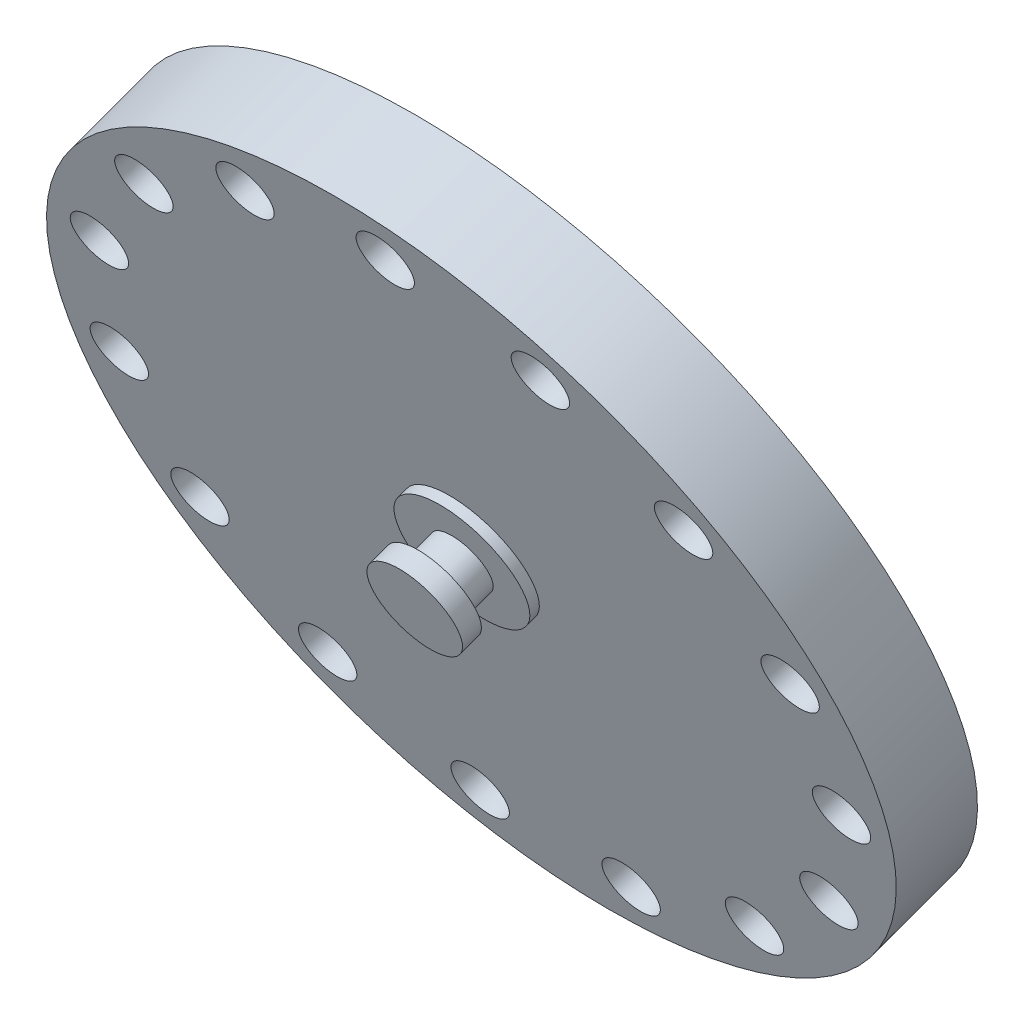
ISO-10303-21;
HEADER;
FILE_DESCRIPTION(('STEP AP214'),'2;1');
FILE_NAME('part.step','',(''),(''),'','','');
FILE_SCHEMA(('AUTOMOTIVE_DESIGN { 1 0 10303 214 1 1 1 1 }'));
ENDSEC;
DATA;
#1=APPLICATION_CONTEXT('core data for automotive mechanical design processes');
#2=APPLICATION_PROTOCOL_DEFINITION('international standard','automotive_design',2000,#1);
#3=PRODUCT_CONTEXT('',#1,'mechanical');
#4=PRODUCT('Part','Part','',(#3));
#5=PRODUCT_RELATED_PRODUCT_CATEGORY('part','',(#4));
#6=PRODUCT_DEFINITION_FORMATION('','',#4);
#7=PRODUCT_DEFINITION_CONTEXT('part definition',#1,'design');
#8=PRODUCT_DEFINITION('design','',#6,#7);
#9=PRODUCT_DEFINITION_SHAPE('','',#8);
#10=(LENGTH_UNIT() NAMED_UNIT(*) SI_UNIT(.MILLI.,.METRE.));
#11=(NAMED_UNIT(*) PLANE_ANGLE_UNIT() SI_UNIT($,.RADIAN.));
#12=(NAMED_UNIT(*) SI_UNIT($,.STERADIAN.) SOLID_ANGLE_UNIT());
#13=UNCERTAINTY_MEASURE_WITH_UNIT(LENGTH_MEASURE(1.E-05),#10,'distance_accuracy_value','');
#14=(GEOMETRIC_REPRESENTATION_CONTEXT(3) GLOBAL_UNCERTAINTY_ASSIGNED_CONTEXT((#13)) GLOBAL_UNIT_ASSIGNED_CONTEXT((#10,
#11,#12)) REPRESENTATION_CONTEXT('',''));
#15=CARTESIAN_POINT('',(0.,0.,0.));
#16=DIRECTION('',(0.,0.,1.));
#17=DIRECTION('',(1.,0.,0.));
#18=AXIS2_PLACEMENT_3D('',#15,#16,#17);
#19=CARTESIAN_POINT('',(0.,-98.7664854138382,198.263578469336));
#20=DIRECTION('',(0.,0.34202014332567,-0.939692620785908));
#21=DIRECTION('',(0.,0.939692620785908,0.34202014332567));
#22=AXIS2_PLACEMENT_3D('',#19,#20,#21);
#23=CYLINDRICAL_SURFACE('',#22,14.75);
#24=CARTESIAN_POINT('',(0.,-90.2159818306964,174.771262949689));
#25=DIRECTION('',(0.,-0.34202014332567,0.939692620785908));
#26=DIRECTION('',(0.,-0.939692620785908,-0.34202014332567));
#27=AXIS2_PLACEMENT_3D('',#24,#25,#26);
#28=CIRCLE('',#27,14.75);
#29=CARTESIAN_POINT('',(0.,-104.076447987289,169.726465835635));
#30=VERTEX_POINT('',#29);
#31=EDGE_CURVE('E48',#30,#30,#28,.T.);
#32=ORIENTED_EDGE('',*,*,#31,.T.);
#33=EDGE_LOOP('',(#32));
#34=FACE_BOUND('',#33,.T.);
#35=CARTESIAN_POINT('',(0.,-95.3462839805815,188.866652261477));
#36=DIRECTION('',(0.,-0.34202014332567,0.939692620785908));
#37=DIRECTION('',(0.,-0.939692620785908,-0.34202014332567));
#38=AXIS2_PLACEMENT_3D('',#35,#36,#37);
#39=CIRCLE('',#38,14.75);
#40=CARTESIAN_POINT('',(0.,-109.206750137174,183.821855147424));
#41=VERTEX_POINT('',#40);
#42=EDGE_CURVE('E10',#41,#41,#39,.T.);
#43=ORIENTED_EDGE('',*,*,#42,.F.);
#44=EDGE_LOOP('',(#43));
#45=FACE_BOUND('',#44,.T.);
#46=ADVANCED_FACE('F31',(#34,#45),#23,.T.);
#47=CARTESIAN_POINT('',(0.,-90.2159818306964,174.771262949689));
#48=DIRECTION('',(0.,0.34202014332567,-0.939692620785908));
#49=DIRECTION('',(0.,0.939692620785908,0.34202014332567));
#50=AXIS2_PLACEMENT_3D('',#47,#48,#49);
#51=CYLINDRICAL_SURFACE('',#50,31.9965910657344);
#52=CARTESIAN_POINT('',(0.,-88.5058811140681,170.072799845759));
#53=DIRECTION('',(0.,-0.34202014332567,0.939692620785908));
#54=DIRECTION('',(0.,-0.939692620785908,-0.34202014332567));
#55=AXIS2_PLACEMENT_3D('',#52,#53,#54);
#56=CIRCLE('',#55,31.9965910657344);
#57=CARTESIAN_POINT('',(0.,-118.572841628843,159.129321183524));
#58=VERTEX_POINT('',#57);
#59=EDGE_CURVE('E49',#58,#58,#56,.T.);
#60=ORIENTED_EDGE('',*,*,#59,.T.);
#61=EDGE_LOOP('',(#60));
#62=FACE_BOUND('',#61,.T.);
#63=CARTESIAN_POINT('',(0.,-90.2159818306964,174.771262949689));
#64=DIRECTION('',(0.,-0.34202014332567,0.939692620785908));
#65=DIRECTION('',(0.,-0.939692620785908,-0.34202014332567));
#66=AXIS2_PLACEMENT_3D('',#63,#64,#65);
#67=CIRCLE('',#66,31.9965910657344);
#68=CARTESIAN_POINT('',(0.,-120.282942345471,163.827784287453));
#69=VERTEX_POINT('',#68);
#70=EDGE_CURVE('E227',#69,#69,#67,.T.);
#71=ORIENTED_EDGE('',*,*,#70,.F.);
#72=EDGE_LOOP('',(#71));
#73=FACE_BOUND('',#72,.T.);
#74=ADVANCED_FACE('F128',(#62,#73),#51,.T.);
#75=CARTESIAN_POINT('',(0.,-90.2159818306964,174.771262949689));
#76=DIRECTION('',(0.,-0.34202014332567,0.939692620785908));
#77=DIRECTION('',(0.,-0.939692620785908,-0.34202014332567));
#78=AXIS2_PLACEMENT_3D('',#75,#76,#77);
#79=PLANE('',#78);
#80=ORIENTED_EDGE('',*,*,#31,.F.);
#81=EDGE_LOOP('',(#80));
#82=FACE_BOUND('',#81,.T.);
#83=ORIENTED_EDGE('',*,*,#70,.T.);
#84=EDGE_LOOP('',(#83));
#85=FACE_BOUND('',#84,.T.);
#86=ADVANCED_FACE('F134',(#82,#85),#79,.T.);
#87=CARTESIAN_POINT('',(0.,-95.3462839805815,188.866652261477));
#88=DIRECTION('',(0.,-0.34202014332567,0.939692620785908));
#89=DIRECTION('',(0.,-0.939692620785908,-0.34202014332567));
#90=AXIS2_PLACEMENT_3D('',#87,#88,#89);
#91=CYLINDRICAL_SURFACE('',#90,22.5167694987839);
#92=CARTESIAN_POINT('',(0.,-95.3462839805815,188.866652261477));
#93=DIRECTION('',(0.,-0.34202014332567,0.939692620785908));
#94=DIRECTION('',(0.,-0.939692620785908,-0.34202014332567));
#95=AXIS2_PLACEMENT_3D('',#92,#93,#94);
#96=CIRCLE('',#95,22.5167694987839);
#97=CARTESIAN_POINT('',(0.,-116.505126122526,181.165463530272));
#98=VERTEX_POINT('',#97);
#99=EDGE_CURVE('E224',#98,#98,#96,.T.);
#100=ORIENTED_EDGE('',*,*,#99,.T.);
#101=EDGE_LOOP('',(#100));
#102=FACE_BOUND('',#101,.T.);
#103=CARTESIAN_POINT('',(0.,-98.7664854138382,198.263578469336));
#104=DIRECTION('',(0.,-0.34202014332567,0.939692620785908));
#105=DIRECTION('',(0.,-0.939692620785908,-0.34202014332567));
#106=AXIS2_PLACEMENT_3D('',#103,#104,#105);
#107=CIRCLE('',#106,22.5167694987839);
#108=CARTESIAN_POINT('',(0.,-119.925327555783,190.562389738131));
#109=VERTEX_POINT('',#108);
#110=EDGE_CURVE('E52',#109,#109,#107,.T.);
#111=ORIENTED_EDGE('',*,*,#110,.F.);
#112=EDGE_LOOP('',(#111));
#113=FACE_BOUND('',#112,.T.);
#114=ADVANCED_FACE('F317',(#102,#113),#91,.T.);
#115=CARTESIAN_POINT('',(0.,-95.3462839805815,188.866652261477));
#116=DIRECTION('',(0.,-0.34202014332567,0.939692620785908));
#117=DIRECTION('',(0.,-0.939692620785908,-0.34202014332567));
#118=AXIS2_PLACEMENT_3D('',#115,#116,#117);
#119=PLANE('',#118);
#120=ORIENTED_EDGE('',*,*,#42,.T.);
#121=EDGE_LOOP('',(#120));
#122=FACE_BOUND('',#121,.T.);
#123=ORIENTED_EDGE('',*,*,#99,.F.);
#124=EDGE_LOOP('',(#123));
#125=FACE_BOUND('',#124,.T.);
#126=ADVANCED_FACE('F324',(#122,#125),#119,.F.);
#127=CARTESIAN_POINT('',(0.,-98.7664854138382,198.263578469336));
#128=DIRECTION('',(0.,-0.34202014332567,0.939692620785908));
#129=DIRECTION('',(0.,-0.939692620785908,-0.34202014332567));
#130=AXIS2_PLACEMENT_3D('',#127,#128,#129);
#131=PLANE('',#130);
#132=ORIENTED_EDGE('',*,*,#110,.T.);
#133=EDGE_LOOP('',(#132));
#134=FACE_BOUND('',#133,.T.);
#135=ADVANCED_FACE('F102',(#134),#131,.T.);
#136=CARTESIAN_POINT('',(0.,-88.5058811140681,170.072799845759));
#137=DIRECTION('',(0.,-0.34202014332567,0.939692620785908));
#138=DIRECTION('',(0.,-0.939692620785908,-0.34202014332567));
#139=AXIS2_PLACEMENT_3D('',#136,#137,#138);
#140=PLANE('',#139);
#141=ORIENTED_EDGE('',*,*,#59,.F.);
#142=EDGE_LOOP('',(#141));
#143=FACE_BOUND('',#142,.T.);
#144=CARTESIAN_POINT('',(86.59372569609,55.1148726556958,222.346479240829));
#145=DIRECTION('',(0.,-0.34202014332567,0.939692620785908));
#146=DIRECTION('',(0.,-0.939692620785908,-0.34202014332567));
#147=AXIS2_PLACEMENT_3D('',#144,#145,#146);
#148=CIRCLE('',#147,13.7620125316147);
#149=CARTESIAN_POINT('',(86.59372569609,42.1828110325743,217.639593742316));
#150=VERTEX_POINT('',#149);
#151=EDGE_CURVE('E61',#150,#150,#148,.T.);
#152=ORIENTED_EDGE('',*,*,#151,.F.);
#153=EDGE_LOOP('',(#152));
#154=FACE_BOUND('',#153,.T.);
#155=CARTESIAN_POINT('',(-55.6382669306373,68.0659589927082,227.060289168913));
#156=DIRECTION('',(0.,-0.34202014332567,0.939692620785908));
#157=DIRECTION('',(0.,-0.939692620785908,-0.34202014332567));
#158=AXIS2_PLACEMENT_3D('',#155,#156,#157);
#159=CIRCLE('',#158,13.7620125316147);
#160=CARTESIAN_POINT('',(-55.6382669306373,55.1338973695867,222.353403670401));
#161=VERTEX_POINT('',#160);
#162=EDGE_CURVE('E67',#161,#161,#159,.T.);
#163=ORIENTED_EDGE('',*,*,#162,.F.);
#164=EDGE_LOOP('',(#163));
#165=FACE_BOUND('',#164,.T.);
#166=CARTESIAN_POINT('',(-161.052260272197,-22.592614265093,194.063267022031));
#167=DIRECTION('',(0.,-0.34202014332567,0.939692620785908));
#168=DIRECTION('',(0.,-0.939692620785908,-0.34202014332567));
#169=AXIS2_PLACEMENT_3D('',#166,#167,#168);
#170=CIRCLE('',#169,13.7620125316147);
#171=CARTESIAN_POINT('',(-161.052260272197,-35.5246758882146,189.356381523519));
#172=VERTEX_POINT('',#171);
#173=EDGE_CURVE('E73',#172,#172,#170,.T.);
#174=ORIENTED_EDGE('',*,*,#173,.F.);
#175=EDGE_LOOP('',(#174));
#176=FACE_BOUND('',#175,.T.);
#177=CARTESIAN_POINT('',(-159.891726212162,-156.868552793349,145.190822219588));
#178=DIRECTION('',(0.,-0.34202014332567,0.939692620785908));
#179=DIRECTION('',(0.,-0.939692620785908,-0.34202014332567));
#180=AXIS2_PLACEMENT_3D('',#177,#178,#179);
#181=CIRCLE('',#180,13.7620125316148);
#182=CARTESIAN_POINT('',(-159.891726212162,-169.80061441647,140.483936721075));
#183=VERTEX_POINT('',#182);
#184=EDGE_CURVE('E79',#183,#183,#181,.T.);
#185=ORIENTED_EDGE('',*,*,#184,.F.);
#186=EDGE_LOOP('',(#185));
#187=FACE_BOUND('',#186,.T.);
#188=CARTESIAN_POINT('',(-52.9246351520203,-245.90625986918,112.783747116672));
#189=DIRECTION('',(0.,-0.34202014332567,0.939692620785908));
#190=DIRECTION('',(0.,-0.939692620785908,-0.34202014332567));
#191=AXIS2_PLACEMENT_3D('',#188,#189,#190);
#192=CIRCLE('',#191,13.7620125316148);
#193=CARTESIAN_POINT('',(-52.9246351520203,-258.838321492302,108.076861618159));
#194=VERTEX_POINT('',#193);
#195=EDGE_CURVE('E85',#194,#194,#192,.T.);
#196=ORIENTED_EDGE('',*,*,#195,.F.);
#197=EDGE_LOOP('',(#196));
#198=FACE_BOUND('',#197,.T.);
#199=CARTESIAN_POINT('',(89.0647397909766,-230.786031189832,118.287060291253));
#200=DIRECTION('',(0.,-0.34202014332567,0.939692620785908));
#201=DIRECTION('',(0.,-0.939692620785908,-0.34202014332567));
#202=AXIS2_PLACEMENT_3D('',#199,#200,#201);
#203=CIRCLE('',#202,13.7620125316147);
#204=CARTESIAN_POINT('',(89.0647397909766,-243.718092812953,113.58017479274));
#205=VERTEX_POINT('',#204);
#206=EDGE_CURVE('E91',#205,#205,#203,.T.);
#207=ORIENTED_EDGE('',*,*,#206,.F.);
#208=EDGE_LOOP('',(#207));
#209=FACE_BOUND('',#208,.T.);
#210=CARTESIAN_POINT('',(172.11652183508,-121.513508545006,158.059005957149));
#211=DIRECTION('',(0.,-0.34202014332567,0.939692620785908));
#212=DIRECTION('',(0.,-0.939692620785908,-0.34202014332567));
#213=AXIS2_PLACEMENT_3D('',#210,#211,#212);
#214=CIRCLE('',#213,13.7620125316148);
#215=CARTESIAN_POINT('',(172.11652183508,-134.445570168128,153.352120458637));
#216=VERTEX_POINT('',#215);
#217=EDGE_CURVE('E54',#216,#216,#214,.T.);
#218=ORIENTED_EDGE('',*,*,#217,.F.);
#219=EDGE_LOOP('',(#218));
#220=FACE_BOUND('',#219,.T.);
#221=CARTESIAN_POINT('',(0.,-88.5058811140681,170.072799845759));
#222=DIRECTION('',(0.,-0.34202014332567,0.939692620785908));
#223=DIRECTION('',(0.,-0.939692620785908,-0.34202014332567));
#224=AXIS2_PLACEMENT_3D('',#221,#222,#223);
#225=CIRCLE('',#224,200.);
#226=CARTESIAN_POINT('',(0.,99.4326430431135,238.476828510893));
#227=VERTEX_POINT('',#226);
#228=EDGE_CURVE('E53',#227,#227,#225,.T.);
#229=ORIENTED_EDGE('',*,*,#228,.T.);
#230=EDGE_LOOP('',(#229));
#231=FACE_BOUND('',#230,.T.);
#232=CARTESIAN_POINT('',(171.523291294432,-52.8756371094876,183.041148103068));
#233=DIRECTION('',(0.,-0.34202014332567,0.939692620785908));
#234=DIRECTION('',(0.,-0.939692620785908,-0.34202014332567));
#235=AXIS2_PLACEMENT_3D('',#232,#233,#234);
#236=CIRCLE('',#235,13.7620125316148);
#237=CARTESIAN_POINT('',(171.523291294432,-65.8076987326092,178.334262604556));
#238=VERTEX_POINT('',#237);
#239=EDGE_CURVE('E35',#238,#238,#236,.T.);
#240=ORIENTED_EDGE('',*,*,#239,.F.);
#241=EDGE_LOOP('',(#240));
#242=FACE_BOUND('',#241,.T.);
#243=CARTESIAN_POINT('',(142.949242120931,-184.444061332834,135.154157916462));
#244=DIRECTION('',(0.,-0.34202014332567,0.939692620785908));
#245=DIRECTION('',(0.,-0.939692620785908,-0.34202014332567));
#246=AXIS2_PLACEMENT_3D('',#243,#244,#245);
#247=CIRCLE('',#246,13.7620125316148);
#248=CARTESIAN_POINT('',(142.949242120931,-197.376122955956,130.447272417949));
#249=VERTEX_POINT('',#248);
#250=EDGE_CURVE('E57',#249,#249,#247,.T.);
#251=ORIENTED_EDGE('',*,*,#250,.F.);
#252=EDGE_LOOP('',(#251));
#253=FACE_BOUND('',#252,.T.);
#254=CARTESIAN_POINT('',(19.7801348234031,-252.526470524145,110.374187493693));
#255=DIRECTION('',(0.,-0.34202014332567,0.939692620785908));
#256=DIRECTION('',(0.,-0.939692620785908,-0.34202014332567));
#257=AXIS2_PLACEMENT_3D('',#254,#255,#256);
#258=CIRCLE('',#257,13.7620125316148);
#259=CARTESIAN_POINT('',(19.7801348234031,-265.458532147267,105.66730199518));
#260=VERTEX_POINT('',#259);
#261=EDGE_CURVE('E88',#260,#260,#258,.T.);
#262=ORIENTED_EDGE('',*,*,#261,.F.);
#263=EDGE_LOOP('',(#262));
#264=FACE_BOUND('',#263,.T.);
#265=CARTESIAN_POINT('',(-116.478254904443,-212.070093789906,125.099104411215));
#266=DIRECTION('',(0.,-0.34202014332567,0.939692620785908));
#267=DIRECTION('',(0.,-0.939692620785908,-0.34202014332567));
#268=AXIS2_PLACEMENT_3D('',#265,#266,#267);
#269=CIRCLE('',#268,13.7620125316147);
#270=CARTESIAN_POINT('',(-116.478254904443,-225.002155413028,120.392218912703));
#271=VERTEX_POINT('',#270);
#272=EDGE_CURVE('E82',#271,#271,#269,.T.);
#273=ORIENTED_EDGE('',*,*,#272,.F.);
#274=EDGE_LOOP('',(#273));
#275=FACE_BOUND('',#274,.T.);
#276=CARTESIAN_POINT('',(-175.658465487067,-89.8464848080683,169.584860005196));
#277=DIRECTION('',(0.,-0.34202014332567,0.939692620785908));
#278=DIRECTION('',(0.,-0.939692620785908,-0.34202014332567));
#279=AXIS2_PLACEMENT_3D('',#276,#277,#278);
#280=CIRCLE('',#279,13.7620125316147);
#281=CARTESIAN_POINT('',(-175.658465487067,-102.77854643119,164.877974506683));
#282=VERTEX_POINT('',#281);
#283=EDGE_CURVE('E76',#282,#282,#280,.T.);
#284=ORIENTED_EDGE('',*,*,#283,.F.);
#285=EDGE_LOOP('',(#284));
#286=FACE_BOUND('',#285,.T.);
#287=CARTESIAN_POINT('',(-118.598656142412,33.2642536364636,214.393504317537));
#288=DIRECTION('',(0.,-0.34202014332567,0.939692620785908));
#289=DIRECTION('',(0.,-0.939692620785908,-0.34202014332567));
#290=AXIS2_PLACEMENT_3D('',#287,#288,#289);
#291=CIRCLE('',#290,13.7620125316147);
#292=CARTESIAN_POINT('',(-118.598656142412,20.3321920133421,209.686618819025));
#293=VERTEX_POINT('',#292);
#294=EDGE_CURVE('E70',#293,#293,#291,.T.);
#295=ORIENTED_EDGE('',*,*,#294,.F.);
#296=EDGE_LOOP('',(#295));
#297=FACE_BOUND('',#296,.T.);
#298=CARTESIAN_POINT('',(16.9424840912313,75.7949707839785,229.873419401228));
#299=DIRECTION('',(0.,-0.34202014332567,0.939692620785908));
#300=DIRECTION('',(0.,-0.939692620785908,-0.34202014332567));
#301=AXIS2_PLACEMENT_3D('',#298,#299,#300);
#302=CIRCLE('',#301,13.7620125316148);
#303=CARTESIAN_POINT('',(16.9424840912313,62.8629091608569,225.166533902715));
#304=VERTEX_POINT('',#303);
#305=EDGE_CURVE('E64',#304,#304,#302,.T.);
#306=ORIENTED_EDGE('',*,*,#305,.F.);
#307=EDGE_LOOP('',(#306));
#308=FACE_BOUND('',#307,.T.);
#309=CARTESIAN_POINT('',(141.272125448793,9.60144144703395,205.780945021553));
#310=DIRECTION('',(0.,-0.34202014332567,0.939692620785908));
#311=DIRECTION('',(0.,-0.939692620785908,-0.34202014332567));
#312=AXIS2_PLACEMENT_3D('',#309,#310,#311);
#313=CIRCLE('',#312,13.7620125316147);
#314=CARTESIAN_POINT('',(141.272125448793,-3.33062017608759,201.074059523041));
#315=VERTEX_POINT('',#314);
#316=EDGE_CURVE('E58',#315,#315,#313,.T.);
#317=ORIENTED_EDGE('',*,*,#316,.F.);
#318=EDGE_LOOP('',(#317));
#319=FACE_BOUND('',#318,.T.);
#320=ADVANCED_FACE('F98',(#143,#154,#165,#176,#187,#198,#209,#220,#231,#242,#253,#264,#275,#286,
#297,#308,#319),#140,.T.);
#321=CARTESIAN_POINT('',(19.7801348234031,-237.819604361141,69.9674047998985));
#322=DIRECTION('',(0.,-0.34202014332567,0.939692620785908));
#323=DIRECTION('',(0.,-0.939692620785908,-0.34202014332567));
#324=AXIS2_PLACEMENT_3D('',#321,#322,#323);
#325=CONICAL_SURFACE('',#324,10.,0.0872664625997167);
#326=CARTESIAN_POINT('',(19.7801348234031,-237.819604361141,69.9674047998985));
#327=DIRECTION('',(0.,-0.34202014332567,0.939692620785908));
#328=DIRECTION('',(0.,-0.939692620785908,-0.34202014332567));
#329=AXIS2_PLACEMENT_3D('',#326,#327,#328);
#330=CIRCLE('',#329,10.);
#331=CARTESIAN_POINT('',(19.7801348234031,-247.216530569,66.5472033666418));
#332=VERTEX_POINT('',#331);
#333=EDGE_CURVE('E232',#332,#332,#330,.T.);
#334=ORIENTED_EDGE('',*,*,#333,.F.);
#335=EDGE_LOOP('',(#334));
#336=FACE_BOUND('',#335,.T.);
#337=ORIENTED_EDGE('',*,*,#261,.T.);
#338=EDGE_LOOP('',(#337));
#339=FACE_BOUND('',#338,.T.);
#340=ADVANCED_FACE('F101',(#336,#339),#325,.F.);
#341=CARTESIAN_POINT('',(89.0647397909766,-216.079165026828,77.8802775974587));
#342=DIRECTION('',(0.,-0.34202014332567,0.939692620785908));
#343=DIRECTION('',(0.,-0.939692620785908,-0.34202014332567));
#344=AXIS2_PLACEMENT_3D('',#341,#342,#343);
#345=CONICAL_SURFACE('',#344,9.99999999999998,0.0872664625997167);
#346=CARTESIAN_POINT('',(89.0647397909766,-216.079165026828,77.8802775974587));
#347=DIRECTION('',(0.,-0.34202014332567,0.939692620785908));
#348=DIRECTION('',(0.,-0.939692620785908,-0.34202014332567));
#349=AXIS2_PLACEMENT_3D('',#346,#347,#348);
#350=CIRCLE('',#349,9.99999999999998);
#351=CARTESIAN_POINT('',(89.0647397909766,-225.476091234687,74.460076164202));
#352=VERTEX_POINT('',#351);
#353=EDGE_CURVE('E235',#352,#352,#350,.T.);
#354=ORIENTED_EDGE('',*,*,#353,.F.);
#355=EDGE_LOOP('',(#354));
#356=FACE_BOUND('',#355,.T.);
#357=ORIENTED_EDGE('',*,*,#206,.T.);
#358=EDGE_LOOP('',(#357));
#359=FACE_BOUND('',#358,.T.);
#360=ADVANCED_FACE('F157',(#356,#359),#345,.F.);
#361=CARTESIAN_POINT('',(142.949242120931,-169.73719516983,94.7473752226675));
#362=DIRECTION('',(0.,-0.34202014332567,0.939692620785908));
#363=DIRECTION('',(0.,-0.939692620785908,-0.34202014332567));
#364=AXIS2_PLACEMENT_3D('',#361,#362,#363);
#365=CONICAL_SURFACE('',#364,10.,0.0872664625997167);
#366=CARTESIAN_POINT('',(142.949242120931,-169.73719516983,94.7473752226675));
#367=DIRECTION('',(0.,-0.34202014332567,0.939692620785908));
#368=DIRECTION('',(0.,-0.939692620785908,-0.34202014332567));
#369=AXIS2_PLACEMENT_3D('',#366,#367,#368);
#370=CIRCLE('',#369,10.);
#371=CARTESIAN_POINT('',(142.949242120931,-179.134121377689,91.3271737894108));
#372=VERTEX_POINT('',#371);
#373=EDGE_CURVE('E238',#372,#372,#370,.T.);
#374=ORIENTED_EDGE('',*,*,#373,.F.);
#375=EDGE_LOOP('',(#374));
#376=FACE_BOUND('',#375,.T.);
#377=ORIENTED_EDGE('',*,*,#250,.T.);
#378=EDGE_LOOP('',(#377));
#379=FACE_BOUND('',#378,.T.);
#380=ADVANCED_FACE('F96',(#376,#379),#365,.F.);
#381=CARTESIAN_POINT('',(16.9424840912313,90.5018369469823,189.466636707434));
#382=DIRECTION('',(0.,-0.34202014332567,0.939692620785908));
#383=DIRECTION('',(0.,-0.939692620785908,-0.34202014332567));
#384=AXIS2_PLACEMENT_3D('',#381,#382,#383);
#385=CONICAL_SURFACE('',#384,10.,0.0872664625997167);
#386=CARTESIAN_POINT('',(16.9424840912313,90.5018369469823,189.466636707434));
#387=DIRECTION('',(0.,-0.34202014332567,0.939692620785908));
#388=DIRECTION('',(0.,-0.939692620785908,-0.34202014332567));
#389=AXIS2_PLACEMENT_3D('',#386,#387,#388);
#390=CIRCLE('',#389,10.);
#391=CARTESIAN_POINT('',(16.9424840912313,81.1049107391232,186.046435274177));
#392=VERTEX_POINT('',#391);
#393=EDGE_CURVE('E241',#392,#392,#390,.T.);
#394=ORIENTED_EDGE('',*,*,#393,.F.);
#395=EDGE_LOOP('',(#394));
#396=FACE_BOUND('',#395,.T.);
#397=ORIENTED_EDGE('',*,*,#305,.T.);
#398=EDGE_LOOP('',(#397));
#399=FACE_BOUND('',#398,.T.);
#400=ADVANCED_FACE('F156',(#396,#399),#385,.F.);
#401=CARTESIAN_POINT('',(-55.6382669306373,82.772825155712,186.653506475119));
#402=DIRECTION('',(0.,-0.34202014332567,0.939692620785908));
#403=DIRECTION('',(0.,-0.939692620785908,-0.34202014332567));
#404=AXIS2_PLACEMENT_3D('',#401,#402,#403);
#405=CONICAL_SURFACE('',#404,9.99999999999998,0.0872664625997167);
#406=CARTESIAN_POINT('',(-55.6382669306373,82.772825155712,186.653506475119));
#407=DIRECTION('',(0.,-0.34202014332567,0.939692620785908));
#408=DIRECTION('',(0.,-0.939692620785908,-0.34202014332567));
#409=AXIS2_PLACEMENT_3D('',#406,#407,#408);
#410=CIRCLE('',#409,9.99999999999998);
#411=CARTESIAN_POINT('',(-55.6382669306373,73.375898947853,183.233305041862));
#412=VERTEX_POINT('',#411);
#413=EDGE_CURVE('E244',#412,#412,#410,.T.);
#414=ORIENTED_EDGE('',*,*,#413,.F.);
#415=EDGE_LOOP('',(#414));
#416=FACE_BOUND('',#415,.T.);
#417=ORIENTED_EDGE('',*,*,#162,.T.);
#418=EDGE_LOOP('',(#417));
#419=FACE_BOUND('',#418,.T.);
#420=ADVANCED_FACE('F187',(#416,#419),#405,.F.);
#421=CARTESIAN_POINT('',(-118.598656142412,47.9711197994674,173.986721623743));
#422=DIRECTION('',(0.,-0.34202014332567,0.939692620785908));
#423=DIRECTION('',(0.,-0.939692620785908,-0.34202014332567));
#424=AXIS2_PLACEMENT_3D('',#421,#422,#423);
#425=CONICAL_SURFACE('',#424,9.99999999999998,0.0872664625997167);
#426=CARTESIAN_POINT('',(-118.598656142412,47.9711197994674,173.986721623743));
#427=DIRECTION('',(0.,-0.34202014332567,0.939692620785908));
#428=DIRECTION('',(0.,-0.939692620785908,-0.34202014332567));
#429=AXIS2_PLACEMENT_3D('',#426,#427,#428);
#430=CIRCLE('',#429,9.99999999999998);
#431=CARTESIAN_POINT('',(-118.598656142412,38.5741935916084,170.566520190487));
#432=VERTEX_POINT('',#431);
#433=EDGE_CURVE('E247',#432,#432,#430,.T.);
#434=ORIENTED_EDGE('',*,*,#433,.F.);
#435=EDGE_LOOP('',(#434));
#436=FACE_BOUND('',#435,.T.);
#437=ORIENTED_EDGE('',*,*,#294,.T.);
#438=EDGE_LOOP('',(#437));
#439=FACE_BOUND('',#438,.T.);
#440=ADVANCED_FACE('F183',(#436,#439),#425,.F.);
#441=CARTESIAN_POINT('',(-161.052260272197,-7.88574810208921,153.656484328237));
#442=DIRECTION('',(0.,-0.34202014332567,0.939692620785908));
#443=DIRECTION('',(0.,-0.939692620785908,-0.34202014332567));
#444=AXIS2_PLACEMENT_3D('',#441,#442,#443);
#445=CONICAL_SURFACE('',#444,9.99999999999998,0.0872664625997167);
#446=CARTESIAN_POINT('',(-161.052260272197,-7.88574810208921,153.656484328237));
#447=DIRECTION('',(0.,-0.34202014332567,0.939692620785908));
#448=DIRECTION('',(0.,-0.939692620785908,-0.34202014332567));
#449=AXIS2_PLACEMENT_3D('',#446,#447,#448);
#450=CIRCLE('',#449,9.99999999999998);
#451=CARTESIAN_POINT('',(-161.052260272197,-17.2826743099483,150.236282894981));
#452=VERTEX_POINT('',#451);
#453=EDGE_CURVE('E250',#452,#452,#450,.T.);
#454=ORIENTED_EDGE('',*,*,#453,.F.);
#455=EDGE_LOOP('',(#454));
#456=FACE_BOUND('',#455,.T.);
#457=ORIENTED_EDGE('',*,*,#173,.T.);
#458=EDGE_LOOP('',(#457));
#459=FACE_BOUND('',#458,.T.);
#460=ADVANCED_FACE('F179',(#456,#459),#445,.F.);
#461=CARTESIAN_POINT('',(-175.658465487067,-75.1396186450644,129.178077311402));
#462=DIRECTION('',(0.,-0.34202014332567,0.939692620785908));
#463=DIRECTION('',(0.,-0.939692620785908,-0.34202014332567));
#464=AXIS2_PLACEMENT_3D('',#461,#462,#463);
#465=CONICAL_SURFACE('',#464,9.99999999999998,0.0872664625997167);
#466=CARTESIAN_POINT('',(-175.658465487067,-75.1396186450644,129.178077311402));
#467=DIRECTION('',(0.,-0.34202014332567,0.939692620785908));
#468=DIRECTION('',(0.,-0.939692620785908,-0.34202014332567));
#469=AXIS2_PLACEMENT_3D('',#466,#467,#468);
#470=CIRCLE('',#469,9.99999999999998);
#471=CARTESIAN_POINT('',(-175.658465487067,-84.5365448529235,125.757875878145));
#472=VERTEX_POINT('',#471);
#473=EDGE_CURVE('E253',#472,#472,#470,.T.);
#474=ORIENTED_EDGE('',*,*,#473,.F.);
#475=EDGE_LOOP('',(#474));
#476=FACE_BOUND('',#475,.T.);
#477=ORIENTED_EDGE('',*,*,#283,.T.);
#478=EDGE_LOOP('',(#477));
#479=FACE_BOUND('',#478,.T.);
#480=ADVANCED_FACE('F175',(#476,#479),#465,.F.);
#481=CARTESIAN_POINT('',(-159.891726212162,-142.161686630345,104.784039525794));
#482=DIRECTION('',(0.,-0.34202014332567,0.939692620785908));
#483=DIRECTION('',(0.,-0.939692620785908,-0.34202014332567));
#484=AXIS2_PLACEMENT_3D('',#481,#482,#483);
#485=CONICAL_SURFACE('',#484,10.,0.0872664625997167);
#486=CARTESIAN_POINT('',(-159.891726212162,-142.161686630345,104.784039525794));
#487=DIRECTION('',(0.,-0.34202014332567,0.939692620785908));
#488=DIRECTION('',(0.,-0.939692620785908,-0.34202014332567));
#489=AXIS2_PLACEMENT_3D('',#486,#487,#488);
#490=CIRCLE('',#489,10.);
#491=CARTESIAN_POINT('',(-159.891726212162,-151.558612838204,101.363838092537));
#492=VERTEX_POINT('',#491);
#493=EDGE_CURVE('E256',#492,#492,#490,.T.);
#494=ORIENTED_EDGE('',*,*,#493,.F.);
#495=EDGE_LOOP('',(#494));
#496=FACE_BOUND('',#495,.T.);
#497=ORIENTED_EDGE('',*,*,#184,.T.);
#498=EDGE_LOOP('',(#497));
#499=FACE_BOUND('',#498,.T.);
#500=ADVANCED_FACE('F171',(#496,#499),#485,.F.);
#501=CARTESIAN_POINT('',(-116.478254904443,-197.363227626902,84.6923217174211));
#502=DIRECTION('',(0.,-0.34202014332567,0.939692620785908));
#503=DIRECTION('',(0.,-0.939692620785908,-0.34202014332567));
#504=AXIS2_PLACEMENT_3D('',#501,#502,#503);
#505=CONICAL_SURFACE('',#504,9.99999999999999,0.0872664625997167);
#506=CARTESIAN_POINT('',(-116.478254904443,-197.363227626902,84.6923217174211));
#507=DIRECTION('',(0.,-0.34202014332567,0.939692620785908));
#508=DIRECTION('',(0.,-0.939692620785908,-0.34202014332567));
#509=AXIS2_PLACEMENT_3D('',#506,#507,#508);
#510=CIRCLE('',#509,9.99999999999999);
#511=CARTESIAN_POINT('',(-116.478254904443,-206.760153834761,81.2721202841644));
#512=VERTEX_POINT('',#511);
#513=EDGE_CURVE('E259',#512,#512,#510,.T.);
#514=ORIENTED_EDGE('',*,*,#513,.F.);
#515=EDGE_LOOP('',(#514));
#516=FACE_BOUND('',#515,.T.);
#517=ORIENTED_EDGE('',*,*,#272,.T.);
#518=EDGE_LOOP('',(#517));
#519=FACE_BOUND('',#518,.T.);
#520=ADVANCED_FACE('F167',(#516,#519),#505,.F.);
#521=CARTESIAN_POINT('',(-52.9246351520203,-231.199393706176,72.3769644228776));
#522=DIRECTION('',(0.,-0.34202014332567,0.939692620785908));
#523=DIRECTION('',(0.,-0.939692620785908,-0.34202014332567));
#524=AXIS2_PLACEMENT_3D('',#521,#522,#523);
#525=CONICAL_SURFACE('',#524,10.,0.0872664625997167);
#526=CARTESIAN_POINT('',(-52.9246351520203,-231.199393706176,72.3769644228776));
#527=DIRECTION('',(0.,-0.34202014332567,0.939692620785908));
#528=DIRECTION('',(0.,-0.939692620785908,-0.34202014332567));
#529=AXIS2_PLACEMENT_3D('',#526,#527,#528);
#530=CIRCLE('',#529,10.);
#531=CARTESIAN_POINT('',(-52.9246351520203,-240.596319914035,68.9567629896209));
#532=VERTEX_POINT('',#531);
#533=EDGE_CURVE('E262',#532,#532,#530,.T.);
#534=ORIENTED_EDGE('',*,*,#533,.F.);
#535=EDGE_LOOP('',(#534));
#536=FACE_BOUND('',#535,.T.);
#537=ORIENTED_EDGE('',*,*,#195,.T.);
#538=EDGE_LOOP('',(#537));
#539=FACE_BOUND('',#538,.T.);
#540=ADVANCED_FACE('F149',(#536,#539),#525,.F.);
#541=CARTESIAN_POINT('',(172.11652183508,-106.806642382002,117.652223263355));
#542=DIRECTION('',(0.,-0.34202014332567,0.939692620785908));
#543=DIRECTION('',(0.,-0.939692620785908,-0.34202014332567));
#544=AXIS2_PLACEMENT_3D('',#541,#542,#543);
#545=CONICAL_SURFACE('',#544,10.,0.0872664625997167);
#546=CARTESIAN_POINT('',(172.11652183508,-106.806642382002,117.652223263355));
#547=DIRECTION('',(0.,-0.34202014332567,0.939692620785908));
#548=DIRECTION('',(0.,-0.939692620785908,-0.34202014332567));
#549=AXIS2_PLACEMENT_3D('',#546,#547,#548);
#550=CIRCLE('',#549,10.);
#551=CARTESIAN_POINT('',(172.11652183508,-116.203568589861,114.232021830098));
#552=VERTEX_POINT('',#551);
#553=EDGE_CURVE('E265',#552,#552,#550,.T.);
#554=ORIENTED_EDGE('',*,*,#553,.F.);
#555=EDGE_LOOP('',(#554));
#556=FACE_BOUND('',#555,.T.);
#557=ORIENTED_EDGE('',*,*,#217,.T.);
#558=EDGE_LOOP('',(#557));
#559=FACE_BOUND('',#558,.T.);
#560=ADVANCED_FACE('F145',(#556,#559),#545,.F.);
#561=CARTESIAN_POINT('',(171.523291294432,-38.1687709464838,142.634365409274));
#562=DIRECTION('',(0.,-0.34202014332567,0.939692620785908));
#563=DIRECTION('',(0.,-0.939692620785908,-0.34202014332567));
#564=AXIS2_PLACEMENT_3D('',#561,#562,#563);
#565=CONICAL_SURFACE('',#564,10.,0.0872664625997167);
#566=CARTESIAN_POINT('',(171.523291294432,-38.1687709464838,142.634365409274));
#567=DIRECTION('',(0.,-0.34202014332567,0.939692620785908));
#568=DIRECTION('',(0.,-0.939692620785908,-0.34202014332567));
#569=AXIS2_PLACEMENT_3D('',#566,#567,#568);
#570=CIRCLE('',#569,10.);
#571=CARTESIAN_POINT('',(171.523291294432,-47.5656971543429,139.214163976018));
#572=VERTEX_POINT('',#571);
#573=EDGE_CURVE('E268',#572,#572,#570,.T.);
#574=ORIENTED_EDGE('',*,*,#573,.F.);
#575=EDGE_LOOP('',(#574));
#576=FACE_BOUND('',#575,.T.);
#577=ORIENTED_EDGE('',*,*,#239,.T.);
#578=EDGE_LOOP('',(#577));
#579=FACE_BOUND('',#578,.T.);
#580=ADVANCED_FACE('F148',(#576,#579),#565,.F.);
#581=CARTESIAN_POINT('',(86.59372569609,69.8217388186996,181.939696547035));
#582=DIRECTION('',(0.,-0.34202014332567,0.939692620785908));
#583=DIRECTION('',(0.,-0.939692620785908,-0.34202014332567));
#584=AXIS2_PLACEMENT_3D('',#581,#582,#583);
#585=CONICAL_SURFACE('',#584,10.,0.0872664625997167);
#586=CARTESIAN_POINT('',(86.59372569609,69.8217388186996,181.939696547035));
#587=DIRECTION('',(0.,-0.34202014332567,0.939692620785908));
#588=DIRECTION('',(0.,-0.939692620785908,-0.34202014332567));
#589=AXIS2_PLACEMENT_3D('',#586,#587,#588);
#590=CIRCLE('',#589,10.);
#591=CARTESIAN_POINT('',(86.59372569609,60.4248126108406,178.519495113778));
#592=VERTEX_POINT('',#591);
#593=EDGE_CURVE('E44',#592,#592,#590,.T.);
#594=ORIENTED_EDGE('',*,*,#593,.F.);
#595=EDGE_LOOP('',(#594));
#596=FACE_BOUND('',#595,.T.);
#597=ORIENTED_EDGE('',*,*,#151,.T.);
#598=EDGE_LOOP('',(#597));
#599=FACE_BOUND('',#598,.T.);
#600=ADVANCED_FACE('F143',(#596,#599),#585,.F.);
#601=CARTESIAN_POINT('',(0.,-280.955630802472,698.824141494341));
#602=DIRECTION('',(0.,0.34202014332567,-0.939692620785908));
#603=DIRECTION('',(0.,0.939692620785908,0.34202014332567));
#604=AXIS2_PLACEMENT_3D('',#601,#602,#603);
#605=CYLINDRICAL_SURFACE('',#604,200.);
#606=CARTESIAN_POINT('',(0.,-73.7990149510642,129.666017151965));
#607=DIRECTION('',(0.,-0.34202014332567,0.939692620785908));
#608=DIRECTION('',(0.,-0.939692620785908,-0.34202014332567));
#609=AXIS2_PLACEMENT_3D('',#606,#607,#608);
#610=CIRCLE('',#609,200.);
#611=CARTESIAN_POINT('',(0.,114.139509206117,198.070045817099));
#612=VERTEX_POINT('',#611);
#613=EDGE_CURVE('E39',#612,#612,#610,.T.);
#614=CARTESIAN_POINT('',(0.,114.139509206117,198.070045817099));
#615=CARTESIAN_POINT('',(0.,113.986312683586,198.490949803493));
#616=CARTESIAN_POINT('',(0.,113.833116161055,198.911853789886));
#617=CARTESIAN_POINT('',(0.,113.526723115992,199.753661762674));
#618=CARTESIAN_POINT('',(0.,113.373526593461,200.174565749067));
#619=CARTESIAN_POINT('',(0.,113.067133548398,201.016373721855));
#620=CARTESIAN_POINT('',(0.,112.913937025867,201.437277708249));
#621=CARTESIAN_POINT('',(0.,112.607543980804,202.279085681036));
#622=CARTESIAN_POINT('',(0.,112.454347458273,202.69998966743));
#623=CARTESIAN_POINT('',(0.,112.147954413211,203.541797640217));
#624=CARTESIAN_POINT('',(0.,111.994757890679,203.962701626611));
#625=CARTESIAN_POINT('',(0.,111.688364845617,204.804509599398));
#626=CARTESIAN_POINT('',(0.,111.535168323085,205.225413585792));
#627=CARTESIAN_POINT('',(0.,111.228775278023,206.067221558579));
#628=CARTESIAN_POINT('',(0.,111.075578755492,206.488125544973));
#629=CARTESIAN_POINT('',(0.,110.769185710429,207.32993351776));
#630=CARTESIAN_POINT('',(0.,110.615989187898,207.750837504154));
#631=CARTESIAN_POINT('',(0.,110.309596142835,208.592645476941));
#632=CARTESIAN_POINT('',(0.,110.156399620304,209.013549463335));
#633=CARTESIAN_POINT('',(0.,109.850006575241,209.855357436122));
#634=CARTESIAN_POINT('',(0.,109.69681005271,210.276261422516));
#635=CARTESIAN_POINT('',(0.,109.390417007647,211.118069395303));
#636=CARTESIAN_POINT('',(0.,109.237220485116,211.538973381697));
#637=CARTESIAN_POINT('',(0.,108.930827440053,212.380781354484));
#638=CARTESIAN_POINT('',(0.,108.777630917522,212.801685340878));
#639=CARTESIAN_POINT('',(0.,108.47123787246,213.643493313665));
#640=CARTESIAN_POINT('',(0.,108.318041349928,214.064397300059));
#641=CARTESIAN_POINT('',(0.,108.011648304866,214.906205272847));
#642=CARTESIAN_POINT('',(0.,107.858451782334,215.32710925924));
#643=CARTESIAN_POINT('',(0.,107.552058737272,216.168917232028));
#644=CARTESIAN_POINT('',(0.,107.398862214741,216.589821218421));
#645=CARTESIAN_POINT('',(0.,107.092469169678,217.431629191209));
#646=CARTESIAN_POINT('',(0.,106.939272647147,217.852533177602));
#647=CARTESIAN_POINT('',(0.,106.632879602084,218.69434115039));
#648=CARTESIAN_POINT('',(0.,106.479683079553,219.115245136783));
#649=CARTESIAN_POINT('',(0.,106.17329003449,219.957053109571));
#650=CARTESIAN_POINT('',(0.,106.020093511959,220.377957095964));
#651=CARTESIAN_POINT('',(0.,105.713700466896,221.219765068752));
#652=CARTESIAN_POINT('',(0.,105.560503944365,221.640669055146));
#653=CARTESIAN_POINT('',(0.,105.254110899303,222.482477027933));
#654=CARTESIAN_POINT('',(0.,105.100914376771,222.903381014327));
#655=CARTESIAN_POINT('',(0.,104.794521331709,223.745188987114));
#656=CARTESIAN_POINT('',(0.,104.641324809177,224.166092973508));
#657=CARTESIAN_POINT('',(0.,104.334931764115,225.007900946295));
#658=CARTESIAN_POINT('',(0.,104.181735241583,225.428804932689));
#659=CARTESIAN_POINT('',(0.,103.875342196521,226.270612905476));
#660=CARTESIAN_POINT('',(0.,103.72214567399,226.69151689187));
#661=CARTESIAN_POINT('',(0.,103.415752628927,227.533324864657));
#662=CARTESIAN_POINT('',(0.,103.262556106396,227.954228851051));
#663=CARTESIAN_POINT('',(0.,102.956163061333,228.796036823838));
#664=CARTESIAN_POINT('',(0.,102.802966538802,229.216940810232));
#665=CARTESIAN_POINT('',(0.,102.496573493739,230.058748783019));
#666=CARTESIAN_POINT('',(0.,102.343376971208,230.479652769413));
#667=CARTESIAN_POINT('',(0.,102.036983926145,231.3214607422));
#668=CARTESIAN_POINT('',(0.,101.883787403614,231.742364728594));
#669=CARTESIAN_POINT('',(0.,101.577394358552,232.584172701382));
#670=CARTESIAN_POINT('',(0.,101.42419783602,233.005076687775));
#671=CARTESIAN_POINT('',(0.,101.117804790958,233.846884660563));
#672=CARTESIAN_POINT('',(0.,100.964608268426,234.267788646956));
#673=CARTESIAN_POINT('',(0.,100.658215223364,235.109596619744));
#674=CARTESIAN_POINT('',(0.,100.505018700833,235.530500606137));
#675=CARTESIAN_POINT('',(0.,100.19862565577,236.372308578925));
#676=CARTESIAN_POINT('',(0.,100.045429133239,236.793212565318));
#677=CARTESIAN_POINT('',(0.,99.7390360881761,237.635020538106));
#678=CARTESIAN_POINT('',(0.,99.5858395656448,238.055924524499));
#679=CARTESIAN_POINT('',(0.,99.4326430431135,238.476828510893));
#680=B_SPLINE_CURVE_WITH_KNOTS('',3,(#614,#615,#616,#617,#618,#619,#620,#621,#622,#623,#624,
#625,#626,#627,#628,#629,#630,#631,#632,#633,#634,#635,#636,#637,#638,#639,#640,#641,#642,#643,
#644,#645,#646,#647,#648,#649,#650,#651,#652,#653,#654,#655,#656,#657,#658,#659,#660,#661,#662,
#663,#664,#665,#666,#667,#668,#669,#670,#671,#672,#673,#674,#675,#676,#677,#678,#679),
.UNSPECIFIED.,.F.,.F.,(4,2,2,2,2,2,2,2,2,2,2,2,2,2,2,2,2,2,2,2,2,2,2,2,2,2,2,2,2,2,2,2,4),(0.,
1.34374999999998,2.68749999999995,4.03125000000004,5.37500000000002,6.71875,8.06249999999996,
9.40624999999994,10.75,12.09375,13.4375,14.78125,16.1249999999999,17.4687499999999,18.8125,
20.15625,21.5,22.8437499999999,24.1874999999999,25.53125,26.875,28.2187499999999,
29.5624999999999,30.9062499999999,32.25,33.59375,34.9374999999999,36.28125,37.625,38.96875,
40.3125000000001,41.65625,43.),.UNSPECIFIED.);
#681=EDGE_CURVE('BSEAM123',#612,#227,#680,.T.);
#682=ORIENTED_EDGE('',*,*,#613,.T.);
#683=ORIENTED_EDGE('',*,*,#228,.F.);
#684=ORIENTED_EDGE('',*,*,#681,.T.);
#685=ORIENTED_EDGE('',*,*,#681,.F.);
#686=EDGE_LOOP('',(#682,#684,#683,#685));
#687=FACE_BOUND('',#686,.T.);
#688=ADVANCED_FACE('F123',(#687),#605,.T.);
#689=CARTESIAN_POINT('',(0.,-73.7990149510642,129.666017151965));
#690=DIRECTION('',(0.,-0.34202014332567,0.939692620785908));
#691=DIRECTION('',(0.,-0.939692620785908,-0.34202014332567));
#692=AXIS2_PLACEMENT_3D('',#689,#690,#691);
#693=PLANE('',#692);
#694=ORIENTED_EDGE('',*,*,#613,.F.);
#695=EDGE_LOOP('',(#694));
#696=FACE_BOUND('',#695,.T.);
#697=ORIENTED_EDGE('',*,*,#593,.T.);
#698=EDGE_LOOP('',(#697));
#699=FACE_BOUND('',#698,.T.);
#700=CARTESIAN_POINT('',(141.272125448793,24.3083076100378,165.374162327759));
#701=DIRECTION('',(0.,-0.34202014332567,0.939692620785908));
#702=DIRECTION('',(0.,-0.939692620785908,-0.34202014332567));
#703=AXIS2_PLACEMENT_3D('',#700,#701,#702);
#704=CIRCLE('',#703,9.99999999999998);
#705=CARTESIAN_POINT('',(141.272125448793,14.9113814021787,161.953960894503));
#706=VERTEX_POINT('',#705);
#707=EDGE_CURVE('E271',#706,#706,#704,.T.);
#708=ORIENTED_EDGE('',*,*,#707,.T.);
#709=EDGE_LOOP('',(#708));
#710=FACE_BOUND('',#709,.T.);
#711=ORIENTED_EDGE('',*,*,#573,.T.);
#712=EDGE_LOOP('',(#711));
#713=FACE_BOUND('',#712,.T.);
#714=ORIENTED_EDGE('',*,*,#553,.T.);
#715=EDGE_LOOP('',(#714));
#716=FACE_BOUND('',#715,.T.);
#717=ORIENTED_EDGE('',*,*,#533,.T.);
#718=EDGE_LOOP('',(#717));
#719=FACE_BOUND('',#718,.T.);
#720=ORIENTED_EDGE('',*,*,#513,.T.);
#721=EDGE_LOOP('',(#720));
#722=FACE_BOUND('',#721,.T.);
#723=ORIENTED_EDGE('',*,*,#493,.T.);
#724=EDGE_LOOP('',(#723));
#725=FACE_BOUND('',#724,.T.);
#726=ORIENTED_EDGE('',*,*,#473,.T.);
#727=EDGE_LOOP('',(#726));
#728=FACE_BOUND('',#727,.T.);
#729=ORIENTED_EDGE('',*,*,#453,.T.);
#730=EDGE_LOOP('',(#729));
#731=FACE_BOUND('',#730,.T.);
#732=ORIENTED_EDGE('',*,*,#433,.T.);
#733=EDGE_LOOP('',(#732));
#734=FACE_BOUND('',#733,.T.);
#735=ORIENTED_EDGE('',*,*,#413,.T.);
#736=EDGE_LOOP('',(#735));
#737=FACE_BOUND('',#736,.T.);
#738=ORIENTED_EDGE('',*,*,#393,.T.);
#739=EDGE_LOOP('',(#738));
#740=FACE_BOUND('',#739,.T.);
#741=ORIENTED_EDGE('',*,*,#373,.T.);
#742=EDGE_LOOP('',(#741));
#743=FACE_BOUND('',#742,.T.);
#744=ORIENTED_EDGE('',*,*,#353,.T.);
#745=EDGE_LOOP('',(#744));
#746=FACE_BOUND('',#745,.T.);
#747=ORIENTED_EDGE('',*,*,#333,.T.);
#748=EDGE_LOOP('',(#747));
#749=FACE_BOUND('',#748,.T.);
#750=ADVANCED_FACE('F118',(#696,#699,#710,#713,#716,#719,#722,#725,#728,#731,#734,#737,#740,
#743,#746,#749),#693,.F.);
#751=CARTESIAN_POINT('',(141.272125448793,24.3083076100378,165.374162327759));
#752=DIRECTION('',(0.,-0.34202014332567,0.939692620785908));
#753=DIRECTION('',(0.,-0.939692620785908,-0.34202014332567));
#754=AXIS2_PLACEMENT_3D('',#751,#752,#753);
#755=CONICAL_SURFACE('',#754,9.99999999999998,0.0872664625997167);
#756=ORIENTED_EDGE('',*,*,#707,.F.);
#757=EDGE_LOOP('',(#756));
#758=FACE_BOUND('',#757,.T.);
#759=ORIENTED_EDGE('',*,*,#316,.T.);
#760=EDGE_LOOP('',(#759));
#761=FACE_BOUND('',#760,.T.);
#762=ADVANCED_FACE('F33',(#758,#761),#755,.F.);
#763=CLOSED_SHELL('',(#46,#74,#86,#114,#126,#135,#320,#340,#360,#380,#400,#420,#440,#460,#480,
#500,#520,#540,#560,#580,#600,#688,#750,#762));
#764=MANIFOLD_SOLID_BREP('B2',#763);
#765=ADVANCED_BREP_SHAPE_REPRESENTATION('',(#18,#764),#14);
#766=SHAPE_DEFINITION_REPRESENTATION(#9,#765);
ENDSEC;
END-ISO-10303-21;
